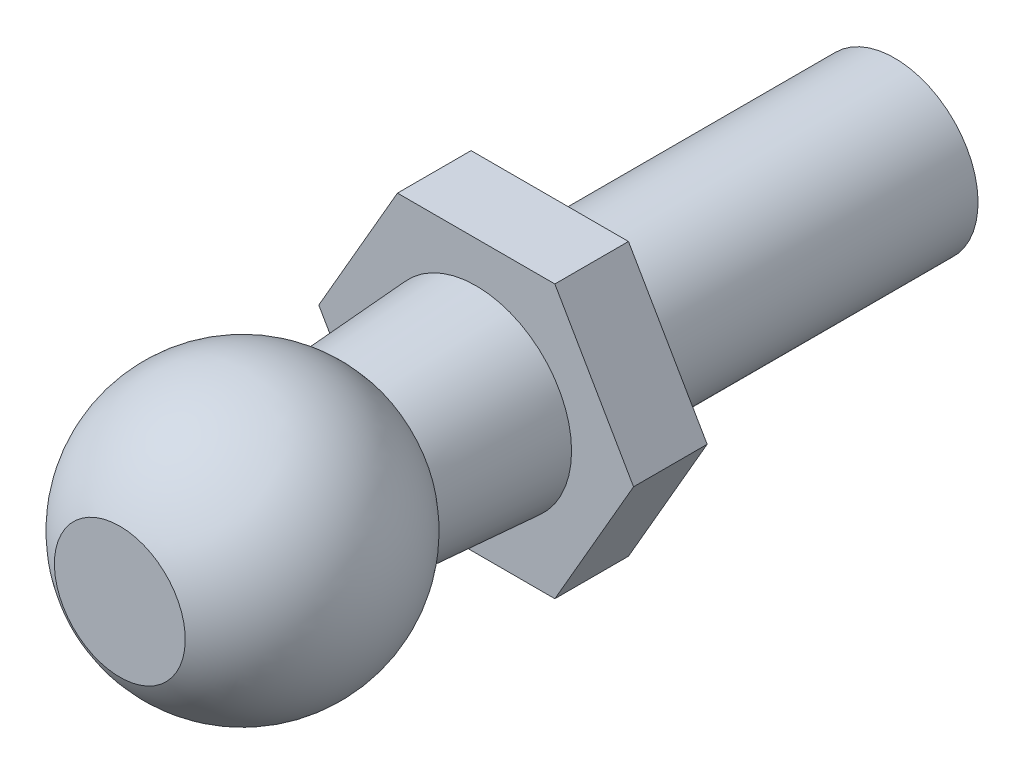
ISO-10303-21;
HEADER;
FILE_DESCRIPTION(('STEP AP214'),'2;1');
FILE_NAME('part.step','',(''),(''),'','','');
FILE_SCHEMA(('AUTOMOTIVE_DESIGN { 1 0 10303 214 1 1 1 1 }'));
ENDSEC;
DATA;
#1=APPLICATION_CONTEXT('core data for automotive mechanical design processes');
#2=APPLICATION_PROTOCOL_DEFINITION('international standard','automotive_design',2000,#1);
#3=PRODUCT_CONTEXT('',#1,'mechanical');
#4=PRODUCT('Part','Part','',(#3));
#5=PRODUCT_RELATED_PRODUCT_CATEGORY('part','',(#4));
#6=PRODUCT_DEFINITION_FORMATION('','',#4);
#7=PRODUCT_DEFINITION_CONTEXT('part definition',#1,'design');
#8=PRODUCT_DEFINITION('design','',#6,#7);
#9=PRODUCT_DEFINITION_SHAPE('','',#8);
#10=(LENGTH_UNIT() NAMED_UNIT(*) SI_UNIT(.MILLI.,.METRE.));
#11=(NAMED_UNIT(*) PLANE_ANGLE_UNIT() SI_UNIT($,.RADIAN.));
#12=(NAMED_UNIT(*) SI_UNIT($,.STERADIAN.) SOLID_ANGLE_UNIT());
#13=UNCERTAINTY_MEASURE_WITH_UNIT(LENGTH_MEASURE(1.E-05),#10,'distance_accuracy_value','');
#14=(GEOMETRIC_REPRESENTATION_CONTEXT(3) GLOBAL_UNCERTAINTY_ASSIGNED_CONTEXT((#13)) GLOBAL_UNIT_ASSIGNED_CONTEXT((#10,
#11,#12)) REPRESENTATION_CONTEXT('',''));
#15=CARTESIAN_POINT('',(0.,0.,0.));
#16=DIRECTION('',(0.,0.,1.));
#17=DIRECTION('',(1.,0.,0.));
#18=AXIS2_PLACEMENT_3D('',#15,#16,#17);
#19=CARTESIAN_POINT('',(0.,4.445,-16.6003553315229));
#20=DIRECTION('',(0.,0.,-1.));
#21=DIRECTION('',(0.,1.,0.));
#22=AXIS2_PLACEMENT_3D('',#19,#20,#21);
#23=PLANE('',#22);
#24=CARTESIAN_POINT('',(0.,0.,-16.6003553315229));
#25=DIRECTION('',(0.,0.,1.));
#26=DIRECTION('',(0.,-1.,0.));
#27=AXIS2_PLACEMENT_3D('',#24,#25,#26);
#28=CIRCLE('',#27,4.445);
#29=CARTESIAN_POINT('',(0.,-4.445,-16.6003553315229));
#30=VERTEX_POINT('',#29);
#31=EDGE_CURVE('E142',#30,#30,#28,.T.);
#32=ORIENTED_EDGE('',*,*,#31,.F.);
#33=EDGE_LOOP('',(#32));
#34=FACE_BOUND('',#33,.T.);
#35=DIRECTION('',(-0.5,-0.866025403784439,0.));
#36=VECTOR('',#35,1.);
#37=CARTESIAN_POINT('',(-7.33234841870825,0.,-16.6003553315229));
#38=LINE('',#37,#36);
#39=CARTESIAN_POINT('',(-3.66617420935412,6.35,-16.6003553315229));
#40=VERTEX_POINT('',#39);
#41=CARTESIAN_POINT('',(-7.33234841870825,0.,-16.6003553315229));
#42=VERTEX_POINT('',#41);
#43=EDGE_CURVE('E110',#40,#42,#38,.T.);
#44=ORIENTED_EDGE('',*,*,#43,.T.);
#45=DIRECTION('',(0.5,-0.866025403784438,0.));
#46=VECTOR('',#45,1.);
#47=CARTESIAN_POINT('',(-3.66617420935412,-6.35,-16.6003553315229));
#48=LINE('',#47,#46);
#49=CARTESIAN_POINT('',(-3.66617420935413,-6.35,-16.6003553315229));
#50=VERTEX_POINT('',#49);
#51=EDGE_CURVE('E108',#42,#50,#48,.T.);
#52=ORIENTED_EDGE('',*,*,#51,.T.);
#53=DIRECTION('',(1.,0.,0.));
#54=VECTOR('',#53,1.);
#55=CARTESIAN_POINT('',(3.66617420935412,-6.35,-16.6003553315229));
#56=LINE('',#55,#54);
#57=CARTESIAN_POINT('',(3.66617420935412,-6.35,-16.6003553315229));
#58=VERTEX_POINT('',#57);
#59=EDGE_CURVE('E58',#50,#58,#56,.T.);
#60=ORIENTED_EDGE('',*,*,#59,.T.);
#61=DIRECTION('',(0.5,0.866025403784438,0.));
#62=VECTOR('',#61,1.);
#63=CARTESIAN_POINT('',(7.33234841870825,0.,-16.6003553315229));
#64=LINE('',#63,#62);
#65=CARTESIAN_POINT('',(7.33234841870825,0.,-16.6003553315229));
#66=VERTEX_POINT('',#65);
#67=EDGE_CURVE('E98',#58,#66,#64,.T.);
#68=ORIENTED_EDGE('',*,*,#67,.T.);
#69=DIRECTION('',(-0.5,0.866025403784438,0.));
#70=VECTOR('',#69,1.);
#71=CARTESIAN_POINT('',(3.66617420935412,6.35,-16.6003553315229));
#72=LINE('',#71,#70);
#73=CARTESIAN_POINT('',(3.66617420935412,6.35,-16.6003553315229));
#74=VERTEX_POINT('',#73);
#75=EDGE_CURVE('E104',#66,#74,#72,.T.);
#76=ORIENTED_EDGE('',*,*,#75,.T.);
#77=DIRECTION('',(-1.,0.,0.));
#78=VECTOR('',#77,1.);
#79=CARTESIAN_POINT('',(-3.66617420935412,6.35,-16.6003553315229));
#80=LINE('',#79,#78);
#81=EDGE_CURVE('E115',#74,#40,#80,.T.);
#82=ORIENTED_EDGE('',*,*,#81,.T.);
#83=EDGE_LOOP('',(#44,#52,#60,#68,#76,#82));
#84=FACE_BOUND('',#83,.T.);
#85=ADVANCED_FACE('F35',(#34,#84),#23,.F.);
#86=CARTESIAN_POINT('',(0.,0.,0.));
#87=DIRECTION('',(0.,0.,-1.));
#88=DIRECTION('',(0.,1.,0.));
#89=AXIS2_PLACEMENT_3D('',#86,#87,#88);
#90=PLANE('',#89);
#91=CARTESIAN_POINT('',(0.,0.,0.));
#92=DIRECTION('',(0.,0.,1.));
#93=DIRECTION('',(0.,-1.,0.));
#94=AXIS2_PLACEMENT_3D('',#91,#92,#93);
#95=CIRCLE('',#94,3.048);
#96=CARTESIAN_POINT('',(0.,3.048,0.));
#97=VERTEX_POINT('',#96);
#98=EDGE_CURVE('E136',#97,#97,#95,.T.);
#99=ORIENTED_EDGE('',*,*,#98,.T.);
#100=EDGE_LOOP('',(#99));
#101=FACE_BOUND('',#100,.T.);
#102=ADVANCED_FACE('F37',(#101),#90,.F.);
#103=CARTESIAN_POINT('',(0.,0.,-16.6003553315229));
#104=DIRECTION('',(0.,0.,-1.));
#105=DIRECTION('',(0.,1.,0.));
#106=AXIS2_PLACEMENT_3D('',#103,#104,#105);
#107=CONICAL_SURFACE('',#106,4.445,0.0651251633343861);
#108=CARTESIAN_POINT('',(0.,0.,-10.7583553315229));
#109=DIRECTION('',(0.,0.,1.));
#110=DIRECTION('',(0.,-1.,0.));
#111=AXIS2_PLACEMENT_3D('',#108,#109,#110);
#112=CIRCLE('',#111,4.064);
#113=CARTESIAN_POINT('',(0.,4.064,-10.7583553315229));
#114=VERTEX_POINT('',#113);
#115=EDGE_CURVE('E139',#114,#114,#112,.T.);
#116=ORIENTED_EDGE('',*,*,#115,.F.);
#117=EDGE_LOOP('',(#116));
#118=FACE_BOUND('',#117,.T.);
#119=ORIENTED_EDGE('',*,*,#31,.T.);
#120=EDGE_LOOP('',(#119));
#121=FACE_BOUND('',#120,.T.);
#122=ADVANCED_FACE('F169',(#118,#121),#107,.T.);
#123=CARTESIAN_POINT('',(0.,0.,-5.715));
#124=DIRECTION('',(0.,0.,1.));
#125=DIRECTION('',(0.,1.,0.));
#126=AXIS2_PLACEMENT_3D('',#123,#124,#125);
#127=SPHERICAL_SURFACE('',#126,6.477);
#128=CARTESIAN_POINT('',(0.,3.048,0.));
#129=CARTESIAN_POINT('',(0.,3.16547952008751,-0.0626494022094853));
#130=CARTESIAN_POINT('',(0.,3.2810214753957,-0.128930466681123));
#131=CARTESIAN_POINT('',(0.,3.50780390048677,-0.268482981844456));
#132=CARTESIAN_POINT('',(0.,3.61904437026964,-0.341754432536153));
#133=CARTESIAN_POINT('',(0.,3.83679746834341,-0.49501478183536));
#134=CARTESIAN_POINT('',(0.,3.9433100966343,-0.57500368044287));
#135=CARTESIAN_POINT('',(0.,4.1512035112119,-0.741393328911676));
#136=CARTESIAN_POINT('',(0.,4.2525842974986,-0.827794078772972));
#137=CARTESIAN_POINT('',(0.,4.44982836307313,-1.0066793653198));
#138=CARTESIAN_POINT('',(0.,4.54569164236096,-1.09916390200534));
#139=CARTESIAN_POINT('',(0.,4.73153631931022,-1.28986505793561));
#140=CARTESIAN_POINT('',(0.,4.82151771697166,-1.38808167718035));
#141=CARTESIAN_POINT('',(0.,4.99525653275237,-1.58987363943355));
#142=CARTESIAN_POINT('',(0.,5.07901395087165,-1.69344898244201));
#143=CARTESIAN_POINT('',(0.,5.23998639379157,-1.9055646245906));
#144=CARTESIAN_POINT('',(0.,5.3172014185922,-2.01410492373073));
#145=CARTESIAN_POINT('',(0.,5.46479552710456,-2.23573784519238));
#146=CARTESIAN_POINT('',(0.,5.53517461081628,-2.3488304675139));
#147=CARTESIAN_POINT('',(0.,5.66882927903404,-2.57913809329582));
#148=CARTESIAN_POINT('',(0.,5.73210486354008,-2.69635309675622));
#149=CARTESIAN_POINT('',(0.,5.8513119799962,-2.93445987152288));
#150=CARTESIAN_POINT('',(0.,5.90724351194629,-3.05535164282915));
#151=CARTESIAN_POINT('',(0.,6.01154988976356,-3.30035236192601));
#152=CARTESIAN_POINT('',(0.,6.05992473563074,-3.4244613097166));
#153=CARTESIAN_POINT('',(0.,6.14893383579468,-3.67542455980924));
#154=CARTESIAN_POINT('',(0.,6.18956809009144,-3.8022788621113));
#155=CARTESIAN_POINT('',(0.,6.26294152885501,-4.05825056229264));
#156=CARTESIAN_POINT('',(0.,6.29568071332184,-4.18736796017192));
#157=CARTESIAN_POINT('',(0.,6.35313954865973,-4.44737498902141));
#158=CARTESIAN_POINT('',(0.,6.3778591995308,-4.57826461999162));
#159=CARTESIAN_POINT('',(0.,6.41918499157879,-4.84131851508004));
#160=CARTESIAN_POINT('',(0.,6.4357911327557,-4.97348277919825));
#161=CARTESIAN_POINT('',(0.,6.46082677425024,-5.238583494898));
#162=CARTESIAN_POINT('',(0.,6.46925627456788,-5.37151994647954));
#163=CARTESIAN_POINT('',(0.,6.47790658811655,-5.63765965581487));
#164=CARTESIAN_POINT('',(0.,6.47812740134759,-5.77086291356866));
#165=CARTESIAN_POINT('',(0.,6.47035950126259,-6.03702983964663));
#166=CARTESIAN_POINT('',(0.,6.46237078794655,-6.16999350797082));
#167=CARTESIAN_POINT('',(0.,6.43821420526609,-6.43517577042991));
#168=CARTESIAN_POINT('',(0.,6.42204633590168,-6.56739436456481));
#169=CARTESIAN_POINT('',(0.,6.38159290611993,-6.83058382641302));
#170=CARTESIAN_POINT('',(0.,6.35730734570259,-6.96155469412633));
#171=CARTESIAN_POINT('',(0.,6.30071085965085,-7.22175079436215));
#172=CARTESIAN_POINT('',(0.,6.26839993401644,-7.35097602688467));
#173=CARTESIAN_POINT('',(0.,6.195875553163,-7.60718958426482));
#174=CARTESIAN_POINT('',(0.,6.15566209794396,-7.73417790912245));
#175=CARTESIAN_POINT('',(0.,6.06748553655901,-7.98543488286056));
#176=CARTESIAN_POINT('',(0.,6.0195224303931,-8.10970353174103));
#177=CARTESIAN_POINT('',(0.,5.91602890685355,-8.35504872392655));
#178=CARTESIAN_POINT('',(0.,5.86049848947992,-8.47612526723161));
#179=CARTESIAN_POINT('',(0.,5.74208145381439,-8.71462595630378));
#180=CARTESIAN_POINT('',(0.,5.67919483552249,-8.83205010207089));
#181=CARTESIAN_POINT('',(0.,5.54630446641447,-9.06279958080751));
#182=CARTESIAN_POINT('',(0.,5.47630071559836,-9.176124913777));
#183=CARTESIAN_POINT('',(0.,5.32944223592566,-9.39824596584488));
#184=CARTESIAN_POINT('',(0.,5.25258750706907,-9.50704168494327));
#185=CARTESIAN_POINT('',(0.,5.0923191625463,-9.71968980953232));
#186=CARTESIAN_POINT('',(0.,5.00890554688011,-9.82354221502298));
#187=CARTESIAN_POINT('',(0.,4.83583685947229,-10.0259092488532));
#188=CARTESIAN_POINT('',(0.,4.74618178773066,-10.1244238771928));
#189=CARTESIAN_POINT('',(0.,4.56096983638084,-10.3157395311922));
#190=CARTESIAN_POINT('',(0.,4.46541295677264,-10.4085405568521));
#191=CARTESIAN_POINT('',(0.,4.26876511198797,-10.5880810758447));
#192=CARTESIAN_POINT('',(0.,4.16767414681149,-10.6748205691774));
#193=CARTESIAN_POINT('',(0.,4.064,-10.7583553315229));
#194=B_SPLINE_CURVE_WITH_KNOTS('',3,(#128,#129,#130,#131,#132,#133,#134,#135,#136,#137,#138,
#139,#140,#141,#142,#143,#144,#145,#146,#147,#148,#149,#150,#151,#152,#153,#154,#155,#156,#157,
#158,#159,#160,#161,#162,#163,#164,#165,#166,#167,#168,#169,#170,#171,#172,#173,#174,#175,#176,
#177,#178,#179,#180,#181,#182,#183,#184,#185,#186,#187,#188,#189,#190,#191,#192,#193),
.UNSPECIFIED.,.F.,.F.,(4,2,2,2,2,2,2,2,2,2,2,2,2,2,2,2,2,2,2,2,2,2,2,2,2,2,2,2,2,2,2,2,4),(0.,
0.399357124180752,0.798714248361505,1.19807137254226,1.59742849672301,1.99678562090376,
2.39614274508451,2.79549986926527,3.19485699344602,3.59421411762677,3.99357124180752,
4.39292836598828,4.79228549016903,5.19164261434978,5.59099973853053,5.99035686271129,
6.38971398689204,6.78907111107279,7.18842823525354,7.5877853594343,7.98714248361505,
8.3864996077958,8.78585673197655,9.1852138561573,9.58457098033806,9.98392810451881,
10.3832852286996,10.7826423528803,11.1819994770611,11.5813566012418,11.9807137254226,
12.3800708496033,12.7794279737841),.UNSPECIFIED.);
#195=EDGE_CURVE('BSEAM248',#97,#114,#194,.T.);
#196=ORIENTED_EDGE('',*,*,#98,.F.);
#197=ORIENTED_EDGE('',*,*,#115,.T.);
#198=ORIENTED_EDGE('',*,*,#195,.T.);
#199=ORIENTED_EDGE('',*,*,#195,.F.);
#200=EDGE_LOOP('',(#196,#198,#197,#199));
#201=FACE_BOUND('',#200,.T.);
#202=ADVANCED_FACE('F248',(#201),#127,.T.);
#203=CARTESIAN_POINT('',(-7.33234841870825,0.,-36.0948553315229));
#204=DIRECTION('',(-0.866025403784439,0.5,0.));
#205=DIRECTION('',(-0.5,-0.866025403784439,0.));
#206=AXIS2_PLACEMENT_3D('',#203,#204,#205);
#207=PLANE('',#206);
#208=DIRECTION('',(-0.5,-0.866025403784439,0.));
#209=VECTOR('',#208,1.);
#210=CARTESIAN_POINT('',(-1.09985226280624,10.795,-20.0293553315229));
#211=LINE('',#210,#209);
#212=CARTESIAN_POINT('',(-3.66617420935412,6.35,-20.0293553315229));
#213=VERTEX_POINT('',#212);
#214=CARTESIAN_POINT('',(-7.33234841870825,0.,-20.0293553315229));
#215=VERTEX_POINT('',#214);
#216=EDGE_CURVE('E134',#213,#215,#211,.T.);
#217=ORIENTED_EDGE('',*,*,#216,.T.);
#218=DIRECTION('',(0.,0.,1.));
#219=VECTOR('',#218,1.);
#220=CARTESIAN_POINT('',(-7.33234841870825,0.,-36.0948553315229));
#221=LINE('',#220,#219);
#222=EDGE_CURVE('E50',#215,#42,#221,.T.);
#223=ORIENTED_EDGE('',*,*,#222,.T.);
#224=ORIENTED_EDGE('',*,*,#43,.F.);
#225=DIRECTION('',(0.,0.,1.));
#226=VECTOR('',#225,1.);
#227=CARTESIAN_POINT('',(-3.66617420935412,6.35,-36.0948553315229));
#228=LINE('',#227,#226);
#229=EDGE_CURVE('E118',#213,#40,#228,.T.);
#230=ORIENTED_EDGE('',*,*,#229,.F.);
#231=EDGE_LOOP('',(#217,#223,#224,#230));
#232=FACE_BOUND('',#231,.T.);
#233=ADVANCED_FACE('F239',(#232),#207,.T.);
#234=CARTESIAN_POINT('',(-3.66617420935412,6.35,-36.0948553315229));
#235=DIRECTION('',(0.,1.,0.));
#236=DIRECTION('',(0.,0.,1.));
#237=AXIS2_PLACEMENT_3D('',#234,#235,#236);
#238=PLANE('',#237);
#239=DIRECTION('',(-1.,0.,0.));
#240=VECTOR('',#239,1.);
#241=CARTESIAN_POINT('',(0.,6.35,-20.0293553315229));
#242=LINE('',#241,#240);
#243=CARTESIAN_POINT('',(3.66617420935412,6.35,-20.0293553315229));
#244=VERTEX_POINT('',#243);
#245=EDGE_CURVE('E132',#244,#213,#242,.T.);
#246=ORIENTED_EDGE('',*,*,#245,.T.);
#247=ORIENTED_EDGE('',*,*,#229,.T.);
#248=ORIENTED_EDGE('',*,*,#81,.F.);
#249=DIRECTION('',(0.,0.,1.));
#250=VECTOR('',#249,1.);
#251=CARTESIAN_POINT('',(3.66617420935412,6.35,-36.0948553315229));
#252=LINE('',#251,#250);
#253=EDGE_CURVE('E121',#244,#74,#252,.T.);
#254=ORIENTED_EDGE('',*,*,#253,.F.);
#255=EDGE_LOOP('',(#246,#247,#248,#254));
#256=FACE_BOUND('',#255,.T.);
#257=ADVANCED_FACE('F229',(#256),#238,.T.);
#258=CARTESIAN_POINT('',(3.66617420935412,6.35,-36.0948553315229));
#259=DIRECTION('',(0.866025403784438,0.5,0.));
#260=DIRECTION('',(-0.5,0.866025403784438,0.));
#261=AXIS2_PLACEMENT_3D('',#258,#259,#260);
#262=PLANE('',#261);
#263=DIRECTION('',(-0.5,0.866025403784438,0.));
#264=VECTOR('',#263,1.);
#265=CARTESIAN_POINT('',(1.09985226280624,10.795,-20.0293553315229));
#266=LINE('',#265,#264);
#267=CARTESIAN_POINT('',(7.33234841870825,0.,-20.0293553315229));
#268=VERTEX_POINT('',#267);
#269=EDGE_CURVE('E130',#268,#244,#266,.T.);
#270=ORIENTED_EDGE('',*,*,#269,.T.);
#271=ORIENTED_EDGE('',*,*,#253,.T.);
#272=ORIENTED_EDGE('',*,*,#75,.F.);
#273=DIRECTION('',(0.,0.,1.));
#274=VECTOR('',#273,1.);
#275=CARTESIAN_POINT('',(7.33234841870825,0.,-36.0948553315229));
#276=LINE('',#275,#274);
#277=EDGE_CURVE('E94',#268,#66,#276,.T.);
#278=ORIENTED_EDGE('',*,*,#277,.F.);
#279=EDGE_LOOP('',(#270,#271,#272,#278));
#280=FACE_BOUND('',#279,.T.);
#281=ADVANCED_FACE('F220',(#280),#262,.T.);
#282=CARTESIAN_POINT('',(7.33234841870825,0.,-36.0948553315229));
#283=DIRECTION('',(0.866025403784438,-0.5,0.));
#284=DIRECTION('',(0.5,0.866025403784438,0.));
#285=AXIS2_PLACEMENT_3D('',#282,#283,#284);
#286=PLANE('',#285);
#287=DIRECTION('',(0.5,0.866025403784438,0.));
#288=VECTOR('',#287,1.);
#289=CARTESIAN_POINT('',(9.89867036525614,4.44499999999999,-20.0293553315229));
#290=LINE('',#289,#288);
#291=CARTESIAN_POINT('',(3.66617420935412,-6.35,-20.0293553315229));
#292=VERTEX_POINT('',#291);
#293=EDGE_CURVE('E128',#292,#268,#290,.T.);
#294=ORIENTED_EDGE('',*,*,#293,.T.);
#295=ORIENTED_EDGE('',*,*,#277,.T.);
#296=ORIENTED_EDGE('',*,*,#67,.F.);
#297=DIRECTION('',(0.,0.,1.));
#298=VECTOR('',#297,1.);
#299=CARTESIAN_POINT('',(3.66617420935412,-6.35,-36.0948553315229));
#300=LINE('',#299,#298);
#301=EDGE_CURVE('E87',#292,#58,#300,.T.);
#302=ORIENTED_EDGE('',*,*,#301,.F.);
#303=EDGE_LOOP('',(#294,#295,#296,#302));
#304=FACE_BOUND('',#303,.T.);
#305=ADVANCED_FACE('F99',(#304),#286,.T.);
#306=CARTESIAN_POINT('',(3.66617420935412,-6.35,-36.0948553315229));
#307=DIRECTION('',(0.,-1.,0.));
#308=DIRECTION('',(1.,0.,0.));
#309=AXIS2_PLACEMENT_3D('',#306,#307,#308);
#310=PLANE('',#309);
#311=DIRECTION('',(1.,0.,0.));
#312=VECTOR('',#311,1.);
#313=CARTESIAN_POINT('',(0.,-6.35,-20.0293553315229));
#314=LINE('',#313,#312);
#315=CARTESIAN_POINT('',(-3.66617420935412,-6.35,-20.0293553315229));
#316=VERTEX_POINT('',#315);
#317=EDGE_CURVE('E91',#316,#292,#314,.T.);
#318=ORIENTED_EDGE('',*,*,#317,.T.);
#319=ORIENTED_EDGE('',*,*,#301,.T.);
#320=ORIENTED_EDGE('',*,*,#59,.F.);
#321=DIRECTION('',(0.,0.,1.));
#322=VECTOR('',#321,1.);
#323=CARTESIAN_POINT('',(-3.66617420935412,-6.35,-36.0948553315229));
#324=LINE('',#323,#322);
#325=EDGE_CURVE('E95',#316,#50,#324,.T.);
#326=ORIENTED_EDGE('',*,*,#325,.F.);
#327=EDGE_LOOP('',(#318,#319,#320,#326));
#328=FACE_BOUND('',#327,.T.);
#329=ADVANCED_FACE('F89',(#328),#310,.T.);
#330=CARTESIAN_POINT('',(-3.66617420935412,-6.35,-36.0948553315229));
#331=DIRECTION('',(-0.866025403784438,-0.5,0.));
#332=DIRECTION('',(0.5,-0.866025403784439,0.));
#333=AXIS2_PLACEMENT_3D('',#330,#331,#332);
#334=PLANE('',#333);
#335=DIRECTION('',(0.5,-0.866025403784439,0.));
#336=VECTOR('',#335,1.);
#337=CARTESIAN_POINT('',(-9.89867036525614,4.445,-20.0293553315229));
#338=LINE('',#337,#336);
#339=EDGE_CURVE('E120',#215,#316,#338,.T.);
#340=ORIENTED_EDGE('',*,*,#339,.T.);
#341=ORIENTED_EDGE('',*,*,#325,.T.);
#342=ORIENTED_EDGE('',*,*,#51,.F.);
#343=ORIENTED_EDGE('',*,*,#222,.F.);
#344=EDGE_LOOP('',(#340,#341,#342,#343));
#345=FACE_BOUND('',#344,.T.);
#346=ADVANCED_FACE('F158',(#345),#334,.T.);
#347=CARTESIAN_POINT('',(0.,3.8862,-36.0948553315229));
#348=DIRECTION('',(0.,0.,1.));
#349=DIRECTION('',(0.,-1.,0.));
#350=AXIS2_PLACEMENT_3D('',#347,#348,#349);
#351=PLANE('',#350);
#352=CARTESIAN_POINT('',(0.,0.,-36.0948553315229));
#353=DIRECTION('',(0.,0.,1.));
#354=DIRECTION('',(0.,-1.,0.));
#355=AXIS2_PLACEMENT_3D('',#352,#353,#354);
#356=CIRCLE('',#355,3.8862);
#357=CARTESIAN_POINT('',(0.,-3.8862,-36.0948553315229));
#358=VERTEX_POINT('',#357);
#359=EDGE_CURVE('E11',#358,#358,#356,.T.);
#360=ORIENTED_EDGE('',*,*,#359,.F.);
#361=EDGE_LOOP('',(#360));
#362=FACE_BOUND('',#361,.T.);
#363=ADVANCED_FACE('F153',(#362),#351,.F.);
#364=CARTESIAN_POINT('',(0.,0.,0.));
#365=DIRECTION('',(0.,0.,1.));
#366=DIRECTION('',(0.,-1.,0.));
#367=AXIS2_PLACEMENT_3D('',#364,#365,#366);
#368=CYLINDRICAL_SURFACE('',#367,3.8862);
#369=CARTESIAN_POINT('',(0.,0.,-20.0293553315229));
#370=DIRECTION('',(0.,0.,1.));
#371=DIRECTION('',(0.,-1.,0.));
#372=AXIS2_PLACEMENT_3D('',#369,#370,#371);
#373=CIRCLE('',#372,3.8862);
#374=CARTESIAN_POINT('',(0.,-3.8862,-20.0293553315229));
#375=VERTEX_POINT('',#374);
#376=EDGE_CURVE('E43',#375,#375,#373,.T.);
#377=ORIENTED_EDGE('',*,*,#376,.F.);
#378=EDGE_LOOP('',(#377));
#379=FACE_BOUND('',#378,.T.);
#380=ORIENTED_EDGE('',*,*,#359,.T.);
#381=EDGE_LOOP('',(#380));
#382=FACE_BOUND('',#381,.T.);
#383=ADVANCED_FACE('F150',(#379,#382),#368,.T.);
#384=CARTESIAN_POINT('',(0.,10.16,-20.0293553315229));
#385=DIRECTION('',(0.,0.,1.));
#386=DIRECTION('',(0.,-1.,0.));
#387=AXIS2_PLACEMENT_3D('',#384,#385,#386);
#388=PLANE('',#387);
#389=ORIENTED_EDGE('',*,*,#376,.T.);
#390=EDGE_LOOP('',(#389));
#391=FACE_BOUND('',#390,.T.);
#392=ORIENTED_EDGE('',*,*,#216,.F.);
#393=ORIENTED_EDGE('',*,*,#245,.F.);
#394=ORIENTED_EDGE('',*,*,#269,.F.);
#395=ORIENTED_EDGE('',*,*,#293,.F.);
#396=ORIENTED_EDGE('',*,*,#317,.F.);
#397=ORIENTED_EDGE('',*,*,#339,.F.);
#398=EDGE_LOOP('',(#392,#393,#394,#395,#396,#397));
#399=FACE_BOUND('',#398,.T.);
#400=ADVANCED_FACE('F147',(#391,#399),#388,.F.);
#401=CLOSED_SHELL('',(#85,#102,#122,#202,#233,#257,#281,#305,#329,#346,#363,#383,#400));
#402=MANIFOLD_SOLID_BREP('B2',#401);
#403=ADVANCED_BREP_SHAPE_REPRESENTATION('',(#18,#402),#14);
#404=SHAPE_DEFINITION_REPRESENTATION(#9,#403);
ENDSEC;
END-ISO-10303-21;
